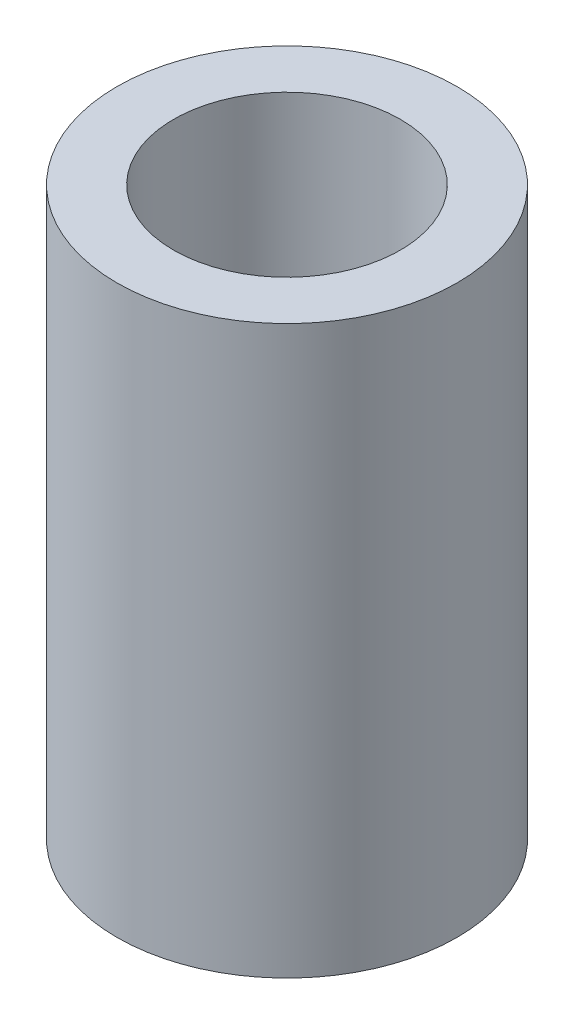
ISO-10303-21;
HEADER;
FILE_DESCRIPTION(('STEP AP214'),'2;1');
FILE_NAME('part.step','',(''),(''),'','','');
FILE_SCHEMA(('AUTOMOTIVE_DESIGN { 1 0 10303 214 1 1 1 1 }'));
ENDSEC;
DATA;
#1=APPLICATION_CONTEXT('core data for automotive mechanical design processes');
#2=APPLICATION_PROTOCOL_DEFINITION('international standard','automotive_design',2000,#1);
#3=PRODUCT_CONTEXT('',#1,'mechanical');
#4=PRODUCT('Part','Part','',(#3));
#5=PRODUCT_RELATED_PRODUCT_CATEGORY('part','',(#4));
#6=PRODUCT_DEFINITION_FORMATION('','',#4);
#7=PRODUCT_DEFINITION_CONTEXT('part definition',#1,'design');
#8=PRODUCT_DEFINITION('design','',#6,#7);
#9=PRODUCT_DEFINITION_SHAPE('','',#8);
#10=(LENGTH_UNIT() NAMED_UNIT(*) SI_UNIT(.MILLI.,.METRE.));
#11=(NAMED_UNIT(*) PLANE_ANGLE_UNIT() SI_UNIT($,.RADIAN.));
#12=(NAMED_UNIT(*) SI_UNIT($,.STERADIAN.) SOLID_ANGLE_UNIT());
#13=UNCERTAINTY_MEASURE_WITH_UNIT(LENGTH_MEASURE(1.E-05),#10,'distance_accuracy_value','');
#14=(GEOMETRIC_REPRESENTATION_CONTEXT(3) GLOBAL_UNCERTAINTY_ASSIGNED_CONTEXT((#13)) GLOBAL_UNIT_ASSIGNED_CONTEXT((#10,
#11,#12)) REPRESENTATION_CONTEXT('',''));
#15=CARTESIAN_POINT('',(0.,0.,0.));
#16=DIRECTION('',(0.,0.,1.));
#17=DIRECTION('',(1.,0.,0.));
#18=AXIS2_PLACEMENT_3D('',#15,#16,#17);
#19=CARTESIAN_POINT('',(0.,5.,0.));
#20=DIRECTION('',(0.,1.,0.));
#21=DIRECTION('',(0.,0.,1.));
#22=AXIS2_PLACEMENT_3D('',#19,#20,#21);
#23=PLANE('',#22);
#24=CARTESIAN_POINT('',(0.,5.,0.));
#25=DIRECTION('',(0.,1.,0.));
#26=DIRECTION('',(0.,0.,1.));
#27=AXIS2_PLACEMENT_3D('',#24,#25,#26);
#28=CIRCLE('',#27,3.);
#29=CARTESIAN_POINT('',(0.,5.,3.));
#30=VERTEX_POINT('',#29);
#31=EDGE_CURVE('E10',#30,#30,#28,.T.);
#32=ORIENTED_EDGE('',*,*,#31,.T.);
#33=EDGE_LOOP('',(#32));
#34=FACE_BOUND('',#33,.T.);
#35=CARTESIAN_POINT('',(0.,5.,0.));
#36=DIRECTION('',(0.,1.,0.));
#37=DIRECTION('',(0.,0.,1.));
#38=AXIS2_PLACEMENT_3D('',#35,#36,#37);
#39=CIRCLE('',#38,2.);
#40=CARTESIAN_POINT('',(0.,5.,2.));
#41=VERTEX_POINT('',#40);
#42=EDGE_CURVE('E41',#41,#41,#39,.T.);
#43=ORIENTED_EDGE('',*,*,#42,.F.);
#44=EDGE_LOOP('',(#43));
#45=FACE_BOUND('',#44,.T.);
#46=ADVANCED_FACE('F30',(#34,#45),#23,.T.);
#47=CARTESIAN_POINT('',(0.,-5.,0.));
#48=DIRECTION('',(0.,1.,0.));
#49=DIRECTION('',(0.,0.,1.));
#50=AXIS2_PLACEMENT_3D('',#47,#48,#49);
#51=PLANE('',#50);
#52=CARTESIAN_POINT('',(0.,-5.,0.));
#53=DIRECTION('',(0.,1.,0.));
#54=DIRECTION('',(0.,0.,1.));
#55=AXIS2_PLACEMENT_3D('',#52,#53,#54);
#56=CIRCLE('',#55,3.);
#57=CARTESIAN_POINT('',(0.,-5.,3.));
#58=VERTEX_POINT('',#57);
#59=EDGE_CURVE('E34',#58,#58,#56,.T.);
#60=ORIENTED_EDGE('',*,*,#59,.F.);
#61=EDGE_LOOP('',(#60));
#62=FACE_BOUND('',#61,.T.);
#63=CARTESIAN_POINT('',(0.,-5.,0.));
#64=DIRECTION('',(0.,1.,0.));
#65=DIRECTION('',(0.,0.,1.));
#66=AXIS2_PLACEMENT_3D('',#63,#64,#65);
#67=CIRCLE('',#66,2.);
#68=CARTESIAN_POINT('',(0.,-5.,2.));
#69=VERTEX_POINT('',#68);
#70=EDGE_CURVE('E43',#69,#69,#67,.T.);
#71=ORIENTED_EDGE('',*,*,#70,.T.);
#72=EDGE_LOOP('',(#71));
#73=FACE_BOUND('',#72,.T.);
#74=ADVANCED_FACE('F53',(#62,#73),#51,.F.);
#75=CARTESIAN_POINT('',(0.,5.,0.));
#76=DIRECTION('',(0.,-1.,0.));
#77=DIRECTION('',(0.,0.,-1.));
#78=AXIS2_PLACEMENT_3D('',#75,#76,#77);
#79=CYLINDRICAL_SURFACE('',#78,3.);
#80=ORIENTED_EDGE('',*,*,#31,.F.);
#81=EDGE_LOOP('',(#80));
#82=FACE_BOUND('',#81,.T.);
#83=ORIENTED_EDGE('',*,*,#59,.T.);
#84=EDGE_LOOP('',(#83));
#85=FACE_BOUND('',#84,.T.);
#86=ADVANCED_FACE('F32',(#82,#85),#79,.T.);
#87=CARTESIAN_POINT('',(0.,5.,0.));
#88=DIRECTION('',(0.,-1.,0.));
#89=DIRECTION('',(0.,0.,-1.));
#90=AXIS2_PLACEMENT_3D('',#87,#88,#89);
#91=CYLINDRICAL_SURFACE('',#90,2.);
#92=ORIENTED_EDGE('',*,*,#42,.T.);
#93=EDGE_LOOP('',(#92));
#94=FACE_BOUND('',#93,.T.);
#95=ORIENTED_EDGE('',*,*,#70,.F.);
#96=EDGE_LOOP('',(#95));
#97=FACE_BOUND('',#96,.T.);
#98=ADVANCED_FACE('F49',(#94,#97),#91,.F.);
#99=CLOSED_SHELL('',(#46,#74,#86,#98));
#100=MANIFOLD_SOLID_BREP('B2',#99);
#101=ADVANCED_BREP_SHAPE_REPRESENTATION('',(#18,#100),#14);
#102=SHAPE_DEFINITION_REPRESENTATION(#9,#101);
ENDSEC;
END-ISO-10303-21;
